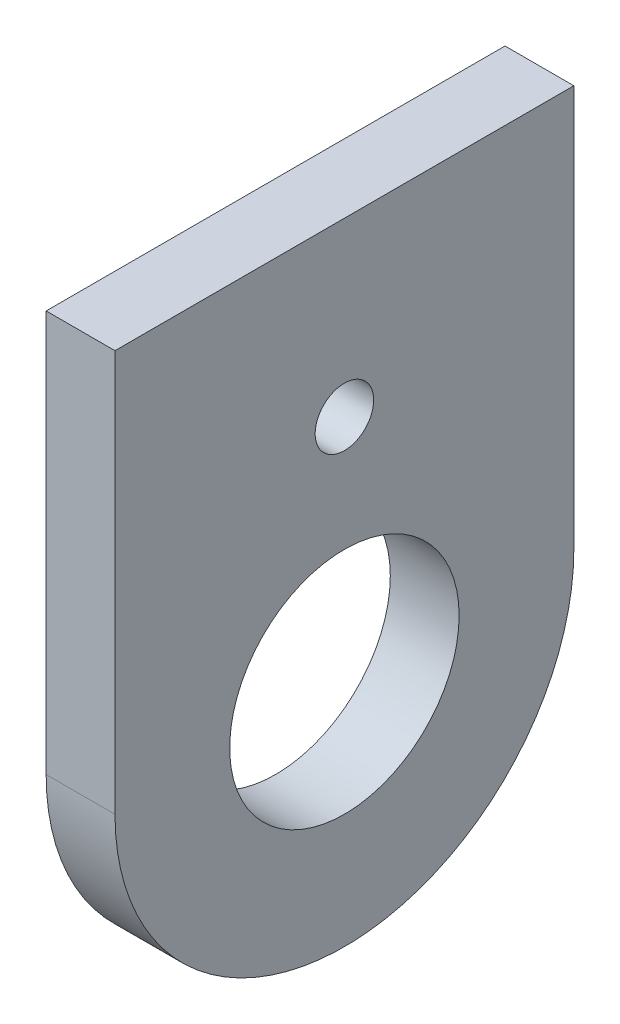
ISO-10303-21;
HEADER;
FILE_DESCRIPTION(('STEP AP214'),'2;1');
FILE_NAME('part.step','',(''),(''),'','','');
FILE_SCHEMA(('AUTOMOTIVE_DESIGN { 1 0 10303 214 1 1 1 1 }'));
ENDSEC;
DATA;
#1=APPLICATION_CONTEXT('core data for automotive mechanical design processes');
#2=APPLICATION_PROTOCOL_DEFINITION('international standard','automotive_design',2000,#1);
#3=PRODUCT_CONTEXT('',#1,'mechanical');
#4=PRODUCT('Part','Part','',(#3));
#5=PRODUCT_RELATED_PRODUCT_CATEGORY('part','',(#4));
#6=PRODUCT_DEFINITION_FORMATION('','',#4);
#7=PRODUCT_DEFINITION_CONTEXT('part definition',#1,'design');
#8=PRODUCT_DEFINITION('design','',#6,#7);
#9=PRODUCT_DEFINITION_SHAPE('','',#8);
#10=(LENGTH_UNIT() NAMED_UNIT(*) SI_UNIT(.MILLI.,.METRE.));
#11=(NAMED_UNIT(*) PLANE_ANGLE_UNIT() SI_UNIT($,.RADIAN.));
#12=(NAMED_UNIT(*) SI_UNIT($,.STERADIAN.) SOLID_ANGLE_UNIT());
#13=UNCERTAINTY_MEASURE_WITH_UNIT(LENGTH_MEASURE(1.E-05),#10,'distance_accuracy_value','');
#14=(GEOMETRIC_REPRESENTATION_CONTEXT(3) GLOBAL_UNCERTAINTY_ASSIGNED_CONTEXT((#13)) GLOBAL_UNIT_ASSIGNED_CONTEXT((#10,
#11,#12)) REPRESENTATION_CONTEXT('',''));
#15=CARTESIAN_POINT('',(0.,0.,0.));
#16=DIRECTION('',(0.,0.,1.));
#17=DIRECTION('',(1.,0.,0.));
#18=AXIS2_PLACEMENT_3D('',#15,#16,#17);
#19=CARTESIAN_POINT('',(12.,0.,0.));
#20=DIRECTION('',(1.,0.,0.));
#21=DIRECTION('',(0.,0.,-1.));
#22=AXIS2_PLACEMENT_3D('',#19,#20,#21);
#23=PLANE('',#22);
#24=CARTESIAN_POINT('',(12.,40.,0.));
#25=DIRECTION('',(1.,0.,0.));
#26=DIRECTION('',(0.,0.,-1.));
#27=AXIS2_PLACEMENT_3D('',#24,#25,#26);
#28=CIRCLE('',#27,5.09999999999999);
#29=CARTESIAN_POINT('',(12.,40.,-5.09999999999999));
#30=VERTEX_POINT('',#29);
#31=EDGE_CURVE('E123',#30,#30,#28,.T.);
#32=ORIENTED_EDGE('',*,*,#31,.F.);
#33=EDGE_LOOP('',(#32));
#34=FACE_BOUND('',#33,.T.);
#35=CARTESIAN_POINT('',(12.,0.,0.));
#36=DIRECTION('',(1.,0.,0.));
#37=DIRECTION('',(0.,0.,-1.));
#38=AXIS2_PLACEMENT_3D('',#35,#36,#37);
#39=CIRCLE('',#38,40.);
#40=CARTESIAN_POINT('',(12.,0.,40.));
#41=VERTEX_POINT('',#40);
#42=CARTESIAN_POINT('',(12.,0.,-40.));
#43=VERTEX_POINT('',#42);
#44=EDGE_CURVE('E88',#41,#43,#39,.T.);
#45=ORIENTED_EDGE('',*,*,#44,.T.);
#46=DIRECTION('',(0.,1.,0.));
#47=VECTOR('',#46,1.);
#48=CARTESIAN_POINT('',(12.,70.,-40.));
#49=LINE('',#48,#47);
#50=CARTESIAN_POINT('',(12.,70.,-40.));
#51=VERTEX_POINT('',#50);
#52=EDGE_CURVE('E83',#43,#51,#49,.T.);
#53=ORIENTED_EDGE('',*,*,#52,.T.);
#54=DIRECTION('',(0.,0.,1.));
#55=VECTOR('',#54,1.);
#56=CARTESIAN_POINT('',(12.,70.,40.));
#57=LINE('',#56,#55);
#58=CARTESIAN_POINT('',(12.,70.,40.));
#59=VERTEX_POINT('',#58);
#60=EDGE_CURVE('E86',#51,#59,#57,.T.);
#61=ORIENTED_EDGE('',*,*,#60,.T.);
#62=DIRECTION('',(0.,-1.,0.));
#63=VECTOR('',#62,1.);
#64=CARTESIAN_POINT('',(12.,0.,40.));
#65=LINE('',#64,#63);
#66=EDGE_CURVE('E53',#59,#41,#65,.T.);
#67=ORIENTED_EDGE('',*,*,#66,.T.);
#68=EDGE_LOOP('',(#45,#53,#61,#67));
#69=FACE_BOUND('',#68,.T.);
#70=CARTESIAN_POINT('',(12.,0.,0.));
#71=DIRECTION('',(1.,0.,0.));
#72=DIRECTION('',(0.,0.,-1.));
#73=AXIS2_PLACEMENT_3D('',#70,#71,#72);
#74=CIRCLE('',#73,20.);
#75=CARTESIAN_POINT('',(12.,0.,-20.));
#76=VERTEX_POINT('',#75);
#77=EDGE_CURVE('E103',#76,#76,#74,.T.);
#78=ORIENTED_EDGE('',*,*,#77,.F.);
#79=EDGE_LOOP('',(#78));
#80=FACE_BOUND('',#79,.T.);
#81=ADVANCED_FACE('F36',(#34,#69,#80),#23,.T.);
#82=CARTESIAN_POINT('',(0.,0.,0.));
#83=DIRECTION('',(1.,0.,0.));
#84=DIRECTION('',(0.,0.,-1.));
#85=AXIS2_PLACEMENT_3D('',#82,#83,#84);
#86=PLANE('',#85);
#87=CARTESIAN_POINT('',(0.,40.,0.));
#88=DIRECTION('',(1.,0.,0.));
#89=DIRECTION('',(0.,0.,-1.));
#90=AXIS2_PLACEMENT_3D('',#87,#88,#89);
#91=CIRCLE('',#90,5.09999999999999);
#92=CARTESIAN_POINT('',(0.,40.,-5.09999999999999));
#93=VERTEX_POINT('',#92);
#94=EDGE_CURVE('E118',#93,#93,#91,.T.);
#95=ORIENTED_EDGE('',*,*,#94,.T.);
#96=EDGE_LOOP('',(#95));
#97=FACE_BOUND('',#96,.T.);
#98=CARTESIAN_POINT('',(0.,0.,0.));
#99=DIRECTION('',(1.,0.,0.));
#100=DIRECTION('',(0.,0.,-1.));
#101=AXIS2_PLACEMENT_3D('',#98,#99,#100);
#102=CIRCLE('',#101,40.);
#103=CARTESIAN_POINT('',(0.,0.,40.));
#104=VERTEX_POINT('',#103);
#105=CARTESIAN_POINT('',(0.,0.,-40.));
#106=VERTEX_POINT('',#105);
#107=EDGE_CURVE('E100',#104,#106,#102,.T.);
#108=ORIENTED_EDGE('',*,*,#107,.F.);
#109=DIRECTION('',(0.,-1.,0.));
#110=VECTOR('',#109,1.);
#111=CARTESIAN_POINT('',(0.,0.,40.));
#112=LINE('',#111,#110);
#113=CARTESIAN_POINT('',(0.,70.,40.));
#114=VERTEX_POINT('',#113);
#115=EDGE_CURVE('E76',#114,#104,#112,.T.);
#116=ORIENTED_EDGE('',*,*,#115,.F.);
#117=DIRECTION('',(0.,0.,1.));
#118=VECTOR('',#117,1.);
#119=CARTESIAN_POINT('',(0.,70.,40.));
#120=LINE('',#119,#118);
#121=CARTESIAN_POINT('',(0.,70.,-40.));
#122=VERTEX_POINT('',#121);
#123=EDGE_CURVE('E70',#122,#114,#120,.T.);
#124=ORIENTED_EDGE('',*,*,#123,.F.);
#125=DIRECTION('',(0.,1.,0.));
#126=VECTOR('',#125,1.);
#127=CARTESIAN_POINT('',(0.,70.,-40.));
#128=LINE('',#127,#126);
#129=EDGE_CURVE('E92',#106,#122,#128,.T.);
#130=ORIENTED_EDGE('',*,*,#129,.F.);
#131=EDGE_LOOP('',(#108,#116,#124,#130));
#132=FACE_BOUND('',#131,.T.);
#133=CARTESIAN_POINT('',(0.,0.,0.));
#134=DIRECTION('',(1.,0.,0.));
#135=DIRECTION('',(0.,0.,-1.));
#136=AXIS2_PLACEMENT_3D('',#133,#134,#135);
#137=CIRCLE('',#136,20.);
#138=CARTESIAN_POINT('',(0.,0.,-20.));
#139=VERTEX_POINT('',#138);
#140=EDGE_CURVE('E115',#139,#139,#137,.T.);
#141=ORIENTED_EDGE('',*,*,#140,.T.);
#142=EDGE_LOOP('',(#141));
#143=FACE_BOUND('',#142,.T.);
#144=ADVANCED_FACE('F111',(#97,#132,#143),#86,.F.);
#145=CARTESIAN_POINT('',(12.,0.,0.));
#146=DIRECTION('',(-1.,0.,0.));
#147=DIRECTION('',(0.,0.,1.));
#148=AXIS2_PLACEMENT_3D('',#145,#146,#147);
#149=CYLINDRICAL_SURFACE('',#148,40.);
#150=ORIENTED_EDGE('',*,*,#107,.T.);
#151=DIRECTION('',(-1.,0.,0.));
#152=VECTOR('',#151,1.);
#153=CARTESIAN_POINT('',(12.,0.,-40.));
#154=LINE('',#153,#152);
#155=EDGE_CURVE('E11',#43,#106,#154,.T.);
#156=ORIENTED_EDGE('',*,*,#155,.F.);
#157=ORIENTED_EDGE('',*,*,#44,.F.);
#158=DIRECTION('',(-1.,0.,0.));
#159=VECTOR('',#158,1.);
#160=CARTESIAN_POINT('',(12.,0.,40.));
#161=LINE('',#160,#159);
#162=EDGE_CURVE('E96',#41,#104,#161,.T.);
#163=ORIENTED_EDGE('',*,*,#162,.T.);
#164=EDGE_LOOP('',(#150,#156,#157,#163));
#165=FACE_BOUND('',#164,.T.);
#166=ADVANCED_FACE('F38',(#165),#149,.T.);
#167=CARTESIAN_POINT('',(12.,70.,-40.));
#168=DIRECTION('',(0.,0.,1.));
#169=DIRECTION('',(1.,0.,0.));
#170=AXIS2_PLACEMENT_3D('',#167,#168,#169);
#171=PLANE('',#170);
#172=ORIENTED_EDGE('',*,*,#129,.T.);
#173=DIRECTION('',(-1.,0.,0.));
#174=VECTOR('',#173,1.);
#175=CARTESIAN_POINT('',(12.,70.,-40.));
#176=LINE('',#175,#174);
#177=EDGE_CURVE('E45',#51,#122,#176,.T.);
#178=ORIENTED_EDGE('',*,*,#177,.F.);
#179=ORIENTED_EDGE('',*,*,#52,.F.);
#180=ORIENTED_EDGE('',*,*,#155,.T.);
#181=EDGE_LOOP('',(#172,#178,#179,#180));
#182=FACE_BOUND('',#181,.T.);
#183=ADVANCED_FACE('F91',(#182),#171,.F.);
#184=CARTESIAN_POINT('',(12.,70.,40.));
#185=DIRECTION('',(0.,-1.,0.));
#186=DIRECTION('',(0.,0.,-1.));
#187=AXIS2_PLACEMENT_3D('',#184,#185,#186);
#188=PLANE('',#187);
#189=ORIENTED_EDGE('',*,*,#123,.T.);
#190=DIRECTION('',(-1.,0.,0.));
#191=VECTOR('',#190,1.);
#192=CARTESIAN_POINT('',(12.,70.,40.));
#193=LINE('',#192,#191);
#194=EDGE_CURVE('E93',#59,#114,#193,.T.);
#195=ORIENTED_EDGE('',*,*,#194,.F.);
#196=ORIENTED_EDGE('',*,*,#60,.F.);
#197=ORIENTED_EDGE('',*,*,#177,.T.);
#198=EDGE_LOOP('',(#189,#195,#196,#197));
#199=FACE_BOUND('',#198,.T.);
#200=ADVANCED_FACE('F94',(#199),#188,.F.);
#201=CARTESIAN_POINT('',(12.,0.,40.));
#202=DIRECTION('',(0.,0.,-1.));
#203=DIRECTION('',(-1.,0.,0.));
#204=AXIS2_PLACEMENT_3D('',#201,#202,#203);
#205=PLANE('',#204);
#206=ORIENTED_EDGE('',*,*,#115,.T.);
#207=ORIENTED_EDGE('',*,*,#162,.F.);
#208=ORIENTED_EDGE('',*,*,#66,.F.);
#209=ORIENTED_EDGE('',*,*,#194,.T.);
#210=EDGE_LOOP('',(#206,#207,#208,#209));
#211=FACE_BOUND('',#210,.T.);
#212=ADVANCED_FACE('F108',(#211),#205,.F.);
#213=CARTESIAN_POINT('',(12.,0.,0.));
#214=DIRECTION('',(-1.,0.,0.));
#215=DIRECTION('',(0.,0.,1.));
#216=AXIS2_PLACEMENT_3D('',#213,#214,#215);
#217=CYLINDRICAL_SURFACE('',#216,20.);
#218=ORIENTED_EDGE('',*,*,#77,.T.);
#219=EDGE_LOOP('',(#218));
#220=FACE_BOUND('',#219,.T.);
#221=ORIENTED_EDGE('',*,*,#140,.F.);
#222=EDGE_LOOP('',(#221));
#223=FACE_BOUND('',#222,.T.);
#224=ADVANCED_FACE('F137',(#220,#223),#217,.F.);
#225=CARTESIAN_POINT('',(12.,40.,0.));
#226=DIRECTION('',(1.,0.,0.));
#227=DIRECTION('',(0.,0.,-1.));
#228=AXIS2_PLACEMENT_3D('',#225,#226,#227);
#229=CYLINDRICAL_SURFACE('',#228,5.09999999999999);
#230=ORIENTED_EDGE('',*,*,#94,.F.);
#231=EDGE_LOOP('',(#230));
#232=FACE_BOUND('',#231,.T.);
#233=ORIENTED_EDGE('',*,*,#31,.T.);
#234=EDGE_LOOP('',(#233));
#235=FACE_BOUND('',#234,.T.);
#236=ADVANCED_FACE('F127',(#232,#235),#229,.F.);
#237=CLOSED_SHELL('',(#81,#144,#166,#183,#200,#212,#224,#236));
#238=MANIFOLD_SOLID_BREP('B2',#237);
#239=ADVANCED_BREP_SHAPE_REPRESENTATION('',(#18,#238),#14);
#240=SHAPE_DEFINITION_REPRESENTATION(#9,#239);
ENDSEC;
END-ISO-10303-21;
